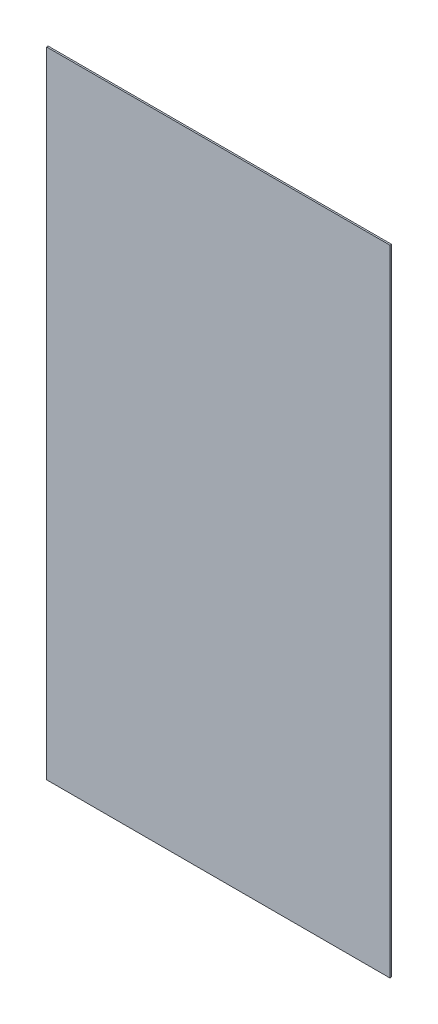
ISO-10303-21;
HEADER;
FILE_DESCRIPTION(('STEP AP214'),'2;1');
FILE_NAME('part.step','',(''),(''),'','','');
FILE_SCHEMA(('AUTOMOTIVE_DESIGN { 1 0 10303 214 1 1 1 1 }'));
ENDSEC;
DATA;
#1=APPLICATION_CONTEXT('core data for automotive mechanical design processes');
#2=APPLICATION_PROTOCOL_DEFINITION('international standard','automotive_design',2000,#1);
#3=PRODUCT_CONTEXT('',#1,'mechanical');
#4=PRODUCT('Part','Part','',(#3));
#5=PRODUCT_RELATED_PRODUCT_CATEGORY('part','',(#4));
#6=PRODUCT_DEFINITION_FORMATION('','',#4);
#7=PRODUCT_DEFINITION_CONTEXT('part definition',#1,'design');
#8=PRODUCT_DEFINITION('design','',#6,#7);
#9=PRODUCT_DEFINITION_SHAPE('','',#8);
#10=(LENGTH_UNIT() NAMED_UNIT(*) SI_UNIT(.MILLI.,.METRE.));
#11=(NAMED_UNIT(*) PLANE_ANGLE_UNIT() SI_UNIT($,.RADIAN.));
#12=(NAMED_UNIT(*) SI_UNIT($,.STERADIAN.) SOLID_ANGLE_UNIT());
#13=UNCERTAINTY_MEASURE_WITH_UNIT(LENGTH_MEASURE(1.E-05),#10,'distance_accuracy_value','');
#14=(GEOMETRIC_REPRESENTATION_CONTEXT(3) GLOBAL_UNCERTAINTY_ASSIGNED_CONTEXT((#13)) GLOBAL_UNIT_ASSIGNED_CONTEXT((#10,
#11,#12)) REPRESENTATION_CONTEXT('',''));
#15=CARTESIAN_POINT('',(0.,0.,0.));
#16=DIRECTION('',(0.,0.,1.));
#17=DIRECTION('',(1.,0.,0.));
#18=AXIS2_PLACEMENT_3D('',#15,#16,#17);
#19=CARTESIAN_POINT('',(340.,1340.,40.));
#20=DIRECTION('',(1.,0.,0.));
#21=DIRECTION('',(0.,0.,-1.));
#22=AXIS2_PLACEMENT_3D('',#19,#20,#21);
#23=PLANE('',#22);
#24=DIRECTION('',(0.,-1.,0.));
#25=VECTOR('',#24,1.);
#26=CARTESIAN_POINT('',(340.,1340.,38.5));
#27=LINE('',#26,#25);
#28=CARTESIAN_POINT('',(340.,1950.,38.5));
#29=VERTEX_POINT('',#28);
#30=CARTESIAN_POINT('',(340.,1340.,38.5));
#31=VERTEX_POINT('',#30);
#32=EDGE_CURVE('E102',#29,#31,#27,.T.);
#33=ORIENTED_EDGE('',*,*,#32,.T.);
#34=DIRECTION('',(0.,0.,-1.));
#35=VECTOR('',#34,1.);
#36=CARTESIAN_POINT('',(340.,1340.,40.));
#37=LINE('',#36,#35);
#38=CARTESIAN_POINT('',(340.,1340.,40.));
#39=VERTEX_POINT('',#38);
#40=EDGE_CURVE('E11',#39,#31,#37,.T.);
#41=ORIENTED_EDGE('',*,*,#40,.F.);
#42=DIRECTION('',(0.,-1.,0.));
#43=VECTOR('',#42,1.);
#44=CARTESIAN_POINT('',(340.,1340.,40.));
#45=LINE('',#44,#43);
#46=CARTESIAN_POINT('',(340.,1950.,40.));
#47=VERTEX_POINT('',#46);
#48=EDGE_CURVE('E90',#47,#39,#45,.T.);
#49=ORIENTED_EDGE('',*,*,#48,.F.);
#50=DIRECTION('',(0.,0.,-1.));
#51=VECTOR('',#50,1.);
#52=CARTESIAN_POINT('',(340.,1950.,40.));
#53=LINE('',#52,#51);
#54=EDGE_CURVE('E98',#47,#29,#53,.T.);
#55=ORIENTED_EDGE('',*,*,#54,.T.);
#56=EDGE_LOOP('',(#33,#41,#49,#55));
#57=FACE_BOUND('',#56,.T.);
#58=ADVANCED_FACE('F39',(#57),#23,.F.);
#59=CARTESIAN_POINT('',(340.,1340.,40.));
#60=DIRECTION('',(0.,1.,0.));
#61=DIRECTION('',(0.,0.,1.));
#62=AXIS2_PLACEMENT_3D('',#59,#60,#61);
#63=PLANE('',#62);
#64=DIRECTION('',(1.,0.,0.));
#65=VECTOR('',#64,1.);
#66=CARTESIAN_POINT('',(340.,1340.,38.5));
#67=LINE('',#66,#65);
#68=CARTESIAN_POINT('',(670.,1340.,38.5));
#69=VERTEX_POINT('',#68);
#70=EDGE_CURVE('E94',#31,#69,#67,.T.);
#71=ORIENTED_EDGE('',*,*,#70,.T.);
#72=DIRECTION('',(0.,0.,-1.));
#73=VECTOR('',#72,1.);
#74=CARTESIAN_POINT('',(670.,1340.,40.));
#75=LINE('',#74,#73);
#76=CARTESIAN_POINT('',(670.,1340.,40.));
#77=VERTEX_POINT('',#76);
#78=EDGE_CURVE('E47',#77,#69,#75,.T.);
#79=ORIENTED_EDGE('',*,*,#78,.F.);
#80=DIRECTION('',(1.,0.,0.));
#81=VECTOR('',#80,1.);
#82=CARTESIAN_POINT('',(340.,1340.,40.));
#83=LINE('',#82,#81);
#84=EDGE_CURVE('E85',#39,#77,#83,.T.);
#85=ORIENTED_EDGE('',*,*,#84,.F.);
#86=ORIENTED_EDGE('',*,*,#40,.T.);
#87=EDGE_LOOP('',(#71,#79,#85,#86));
#88=FACE_BOUND('',#87,.T.);
#89=ADVANCED_FACE('F93',(#88),#63,.F.);
#90=CARTESIAN_POINT('',(670.,1340.,40.));
#91=DIRECTION('',(-1.,0.,0.));
#92=DIRECTION('',(0.,0.,1.));
#93=AXIS2_PLACEMENT_3D('',#90,#91,#92);
#94=PLANE('',#93);
#95=DIRECTION('',(0.,1.,0.));
#96=VECTOR('',#95,1.);
#97=CARTESIAN_POINT('',(670.,1340.,38.5));
#98=LINE('',#97,#96);
#99=CARTESIAN_POINT('',(670.,1950.,38.5));
#100=VERTEX_POINT('',#99);
#101=EDGE_CURVE('E72',#69,#100,#98,.T.);
#102=ORIENTED_EDGE('',*,*,#101,.T.);
#103=DIRECTION('',(0.,0.,-1.));
#104=VECTOR('',#103,1.);
#105=CARTESIAN_POINT('',(670.,1950.,40.));
#106=LINE('',#105,#104);
#107=CARTESIAN_POINT('',(670.,1950.,40.));
#108=VERTEX_POINT('',#107);
#109=EDGE_CURVE('E95',#108,#100,#106,.T.);
#110=ORIENTED_EDGE('',*,*,#109,.F.);
#111=DIRECTION('',(0.,1.,0.));
#112=VECTOR('',#111,1.);
#113=CARTESIAN_POINT('',(670.,1340.,40.));
#114=LINE('',#113,#112);
#115=EDGE_CURVE('E88',#77,#108,#114,.T.);
#116=ORIENTED_EDGE('',*,*,#115,.F.);
#117=ORIENTED_EDGE('',*,*,#78,.T.);
#118=EDGE_LOOP('',(#102,#110,#116,#117));
#119=FACE_BOUND('',#118,.T.);
#120=ADVANCED_FACE('F96',(#119),#94,.F.);
#121=CARTESIAN_POINT('',(340.,1950.,40.));
#122=DIRECTION('',(0.,-1.,0.));
#123=DIRECTION('',(0.,0.,-1.));
#124=AXIS2_PLACEMENT_3D('',#121,#122,#123);
#125=PLANE('',#124);
#126=DIRECTION('',(-1.,0.,0.));
#127=VECTOR('',#126,1.);
#128=CARTESIAN_POINT('',(340.,1950.,38.5));
#129=LINE('',#128,#127);
#130=EDGE_CURVE('E78',#100,#29,#129,.T.);
#131=ORIENTED_EDGE('',*,*,#130,.T.);
#132=ORIENTED_EDGE('',*,*,#54,.F.);
#133=DIRECTION('',(-1.,0.,0.));
#134=VECTOR('',#133,1.);
#135=CARTESIAN_POINT('',(340.,1950.,40.));
#136=LINE('',#135,#134);
#137=EDGE_CURVE('E55',#108,#47,#136,.T.);
#138=ORIENTED_EDGE('',*,*,#137,.F.);
#139=ORIENTED_EDGE('',*,*,#109,.T.);
#140=EDGE_LOOP('',(#131,#132,#138,#139));
#141=FACE_BOUND('',#140,.T.);
#142=ADVANCED_FACE('F109',(#141),#125,.F.);
#143=CARTESIAN_POINT('',(0.,0.,40.));
#144=DIRECTION('',(0.,0.,-1.));
#145=DIRECTION('',(-1.,0.,0.));
#146=AXIS2_PLACEMENT_3D('',#143,#144,#145);
#147=PLANE('',#146);
#148=ORIENTED_EDGE('',*,*,#48,.T.);
#149=ORIENTED_EDGE('',*,*,#84,.T.);
#150=ORIENTED_EDGE('',*,*,#115,.T.);
#151=ORIENTED_EDGE('',*,*,#137,.T.);
#152=EDGE_LOOP('',(#148,#149,#150,#151));
#153=FACE_BOUND('',#152,.T.);
#154=ADVANCED_FACE('F86',(#153),#147,.F.);
#155=CARTESIAN_POINT('',(0.,0.,38.5));
#156=DIRECTION('',(0.,0.,-1.));
#157=DIRECTION('',(-1.,0.,0.));
#158=AXIS2_PLACEMENT_3D('',#155,#156,#157);
#159=PLANE('',#158);
#160=ORIENTED_EDGE('',*,*,#32,.F.);
#161=ORIENTED_EDGE('',*,*,#130,.F.);
#162=ORIENTED_EDGE('',*,*,#101,.F.);
#163=ORIENTED_EDGE('',*,*,#70,.F.);
#164=EDGE_LOOP('',(#160,#161,#162,#163));
#165=FACE_BOUND('',#164,.T.);
#166=ADVANCED_FACE('F112',(#165),#159,.T.);
#167=CLOSED_SHELL('',(#58,#89,#120,#142,#154,#166));
#168=MANIFOLD_SOLID_BREP('B2',#167);
#169=ADVANCED_BREP_SHAPE_REPRESENTATION('',(#18,#168),#14);
#170=SHAPE_DEFINITION_REPRESENTATION(#9,#169);
ENDSEC;
END-ISO-10303-21;
